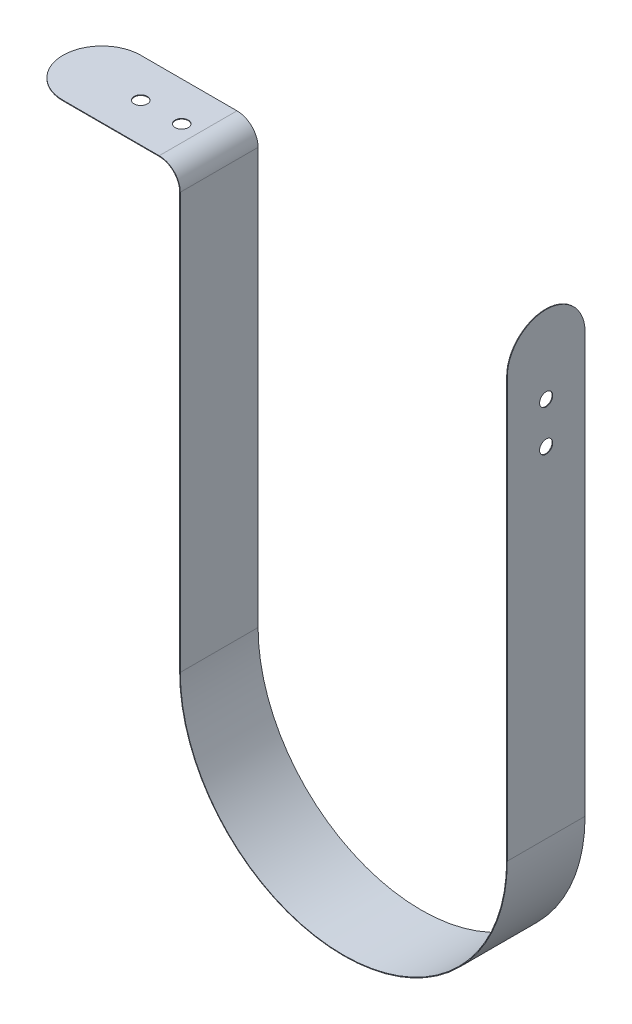
ISO-10303-21;
HEADER;
FILE_DESCRIPTION(('STEP AP214'),'2;1');
FILE_NAME('part.step','',(''),(''),'','','');
FILE_SCHEMA(('AUTOMOTIVE_DESIGN { 1 0 10303 214 1 1 1 1 }'));
ENDSEC;
DATA;
#1=APPLICATION_CONTEXT('core data for automotive mechanical design processes');
#2=APPLICATION_PROTOCOL_DEFINITION('international standard','automotive_design',2000,#1);
#3=PRODUCT_CONTEXT('',#1,'mechanical');
#4=PRODUCT('Part','Part','',(#3));
#5=PRODUCT_RELATED_PRODUCT_CATEGORY('part','',(#4));
#6=PRODUCT_DEFINITION_FORMATION('','',#4);
#7=PRODUCT_DEFINITION_CONTEXT('part definition',#1,'design');
#8=PRODUCT_DEFINITION('design','',#6,#7);
#9=PRODUCT_DEFINITION_SHAPE('','',#8);
#10=(LENGTH_UNIT() NAMED_UNIT(*) SI_UNIT(.MILLI.,.METRE.));
#11=(NAMED_UNIT(*) PLANE_ANGLE_UNIT() SI_UNIT($,.RADIAN.));
#12=(NAMED_UNIT(*) SI_UNIT($,.STERADIAN.) SOLID_ANGLE_UNIT());
#13=UNCERTAINTY_MEASURE_WITH_UNIT(LENGTH_MEASURE(1.E-05),#10,'distance_accuracy_value','');
#14=(GEOMETRIC_REPRESENTATION_CONTEXT(3) GLOBAL_UNCERTAINTY_ASSIGNED_CONTEXT((#13)) GLOBAL_UNIT_ASSIGNED_CONTEXT((#10,
#11,#12)) REPRESENTATION_CONTEXT('',''));
#15=CARTESIAN_POINT('',(0.,0.,0.));
#16=DIRECTION('',(0.,0.,1.));
#17=DIRECTION('',(1.,0.,0.));
#18=AXIS2_PLACEMENT_3D('',#15,#16,#17);
#19=CARTESIAN_POINT('',(0.,0.150000000000001,-9.5));
#20=DIRECTION('',(0.,1.,0.));
#21=DIRECTION('',(0.,0.,1.));
#22=AXIS2_PLACEMENT_3D('',#19,#20,#21);
#23=PLANE('',#22);
#24=CARTESIAN_POINT('',(4.,0.149999999999999,0.));
#25=DIRECTION('',(0.,1.,0.));
#26=DIRECTION('',(0.,0.,1.));
#27=AXIS2_PLACEMENT_3D('',#24,#25,#26);
#28=CIRCLE('',#27,1.6);
#29=CARTESIAN_POINT('',(4.,0.149999999999999,1.6));
#30=VERTEX_POINT('',#29);
#31=EDGE_CURVE('E303',#30,#30,#28,.T.);
#32=ORIENTED_EDGE('',*,*,#31,.F.);
#33=EDGE_LOOP('',(#32));
#34=FACE_BOUND('',#33,.T.);
#35=CARTESIAN_POINT('',(14.,0.149999999999999,0.));
#36=DIRECTION('',(0.,1.,0.));
#37=DIRECTION('',(0.,0.,1.));
#38=AXIS2_PLACEMENT_3D('',#35,#36,#37);
#39=CIRCLE('',#38,1.6);
#40=CARTESIAN_POINT('',(14.,0.149999999999999,1.6));
#41=VERTEX_POINT('',#40);
#42=EDGE_CURVE('E302',#41,#41,#39,.T.);
#43=ORIENTED_EDGE('',*,*,#42,.F.);
#44=EDGE_LOOP('',(#43));
#45=FACE_BOUND('',#44,.T.);
#46=CARTESIAN_POINT('',(-5.5,0.15,0.));
#47=DIRECTION('',(0.,1.,0.));
#48=DIRECTION('',(0.,0.,1.));
#49=AXIS2_PLACEMENT_3D('',#46,#47,#48);
#50=CIRCLE('',#49,9.5);
#51=CARTESIAN_POINT('',(-5.5,0.150000000000001,-9.5));
#52=VERTEX_POINT('',#51);
#53=CARTESIAN_POINT('',(-15.,0.15,0.));
#54=VERTEX_POINT('',#53);
#55=EDGE_CURVE('E313',#52,#54,#50,.T.);
#56=ORIENTED_EDGE('',*,*,#55,.T.);
#57=CARTESIAN_POINT('',(-5.5,0.15,0.));
#58=DIRECTION('',(0.,1.,0.));
#59=DIRECTION('',(0.,0.,1.));
#60=AXIS2_PLACEMENT_3D('',#57,#58,#59);
#61=CIRCLE('',#60,9.5);
#62=CARTESIAN_POINT('',(-5.5,0.149999999999998,9.5));
#63=VERTEX_POINT('',#62);
#64=EDGE_CURVE('E316',#54,#63,#61,.T.);
#65=ORIENTED_EDGE('',*,*,#64,.T.);
#66=DIRECTION('',(1.,0.,0.));
#67=VECTOR('',#66,1.);
#68=CARTESIAN_POINT('',(0.,0.149999999999998,9.5));
#69=LINE('',#68,#67);
#70=CARTESIAN_POINT('',(18.,0.149999999999998,9.5));
#71=VERTEX_POINT('',#70);
#72=EDGE_CURVE('E174',#63,#71,#69,.T.);
#73=ORIENTED_EDGE('',*,*,#72,.T.);
#74=DIRECTION('',(0.,0.,1.));
#75=VECTOR('',#74,1.);
#76=CARTESIAN_POINT('',(18.,0.150000000000001,-9.5));
#77=LINE('',#76,#75);
#78=CARTESIAN_POINT('',(18.,0.150000000000001,-9.5));
#79=VERTEX_POINT('',#78);
#80=EDGE_CURVE('E150',#79,#71,#77,.T.);
#81=ORIENTED_EDGE('',*,*,#80,.F.);
#82=DIRECTION('',(1.,0.,0.));
#83=VECTOR('',#82,1.);
#84=CARTESIAN_POINT('',(0.,0.150000000000001,-9.5));
#85=LINE('',#84,#83);
#86=EDGE_CURVE('E137',#52,#79,#85,.T.);
#87=ORIENTED_EDGE('',*,*,#86,.F.);
#88=EDGE_LOOP('',(#56,#65,#73,#81,#87));
#89=FACE_BOUND('',#88,.T.);
#90=ADVANCED_FACE('F37',(#34,#45,#89),#23,.T.);
#91=CARTESIAN_POINT('',(0.,0.149999999999998,9.5));
#92=DIRECTION('',(0.,0.,1.));
#93=DIRECTION('',(1.,0.,0.));
#94=AXIS2_PLACEMENT_3D('',#91,#92,#93);
#95=PLANE('',#94);
#96=ORIENTED_EDGE('',*,*,#72,.F.);
#97=DIRECTION('',(0.,-1.,0.));
#98=VECTOR('',#97,1.);
#99=CARTESIAN_POINT('',(-5.5,0.,9.5));
#100=LINE('',#99,#98);
#101=CARTESIAN_POINT('',(-5.5,0.,9.5));
#102=VERTEX_POINT('',#101);
#103=EDGE_CURVE('E287',#63,#102,#100,.T.);
#104=ORIENTED_EDGE('',*,*,#103,.T.);
#105=DIRECTION('',(1.,0.,0.));
#106=VECTOR('',#105,1.);
#107=CARTESIAN_POINT('',(0.,0.,9.5));
#108=LINE('',#107,#106);
#109=CARTESIAN_POINT('',(18.,0.,9.5));
#110=VERTEX_POINT('',#109);
#111=EDGE_CURVE('E231',#102,#110,#108,.T.);
#112=ORIENTED_EDGE('',*,*,#111,.T.);
#113=DIRECTION('',(0.,-1.,0.));
#114=VECTOR('',#113,1.);
#115=CARTESIAN_POINT('',(18.,0.149999999999998,9.5));
#116=LINE('',#115,#114);
#117=EDGE_CURVE('E181',#71,#110,#116,.T.);
#118=ORIENTED_EDGE('',*,*,#117,.F.);
#119=EDGE_LOOP('',(#96,#104,#112,#118));
#120=FACE_BOUND('',#119,.T.);
#121=ADVANCED_FACE('F402',(#120),#95,.T.);
#122=CARTESIAN_POINT('',(0.,0.,-9.5));
#123=DIRECTION('',(0.,-1.,0.));
#124=DIRECTION('',(0.,0.,-1.));
#125=AXIS2_PLACEMENT_3D('',#122,#123,#124);
#126=PLANE('',#125);
#127=CARTESIAN_POINT('',(4.,0.,0.));
#128=DIRECTION('',(0.,-1.,0.));
#129=DIRECTION('',(0.,0.,-1.));
#130=AXIS2_PLACEMENT_3D('',#127,#128,#129);
#131=CIRCLE('',#130,1.59999999999998);
#132=CARTESIAN_POINT('',(4.,0.,-1.59999999999998));
#133=VERTEX_POINT('',#132);
#134=EDGE_CURVE('E298',#133,#133,#131,.T.);
#135=ORIENTED_EDGE('',*,*,#134,.F.);
#136=EDGE_LOOP('',(#135));
#137=FACE_BOUND('',#136,.T.);
#138=CARTESIAN_POINT('',(14.,0.,0.));
#139=DIRECTION('',(0.,-1.,0.));
#140=DIRECTION('',(0.,0.,-1.));
#141=AXIS2_PLACEMENT_3D('',#138,#139,#140);
#142=CIRCLE('',#141,1.59999999999998);
#143=CARTESIAN_POINT('',(14.,0.,-1.59999999999998));
#144=VERTEX_POINT('',#143);
#145=EDGE_CURVE('E151',#144,#144,#142,.T.);
#146=ORIENTED_EDGE('',*,*,#145,.F.);
#147=EDGE_LOOP('',(#146));
#148=FACE_BOUND('',#147,.T.);
#149=ORIENTED_EDGE('',*,*,#111,.F.);
#150=CARTESIAN_POINT('',(-5.5,0.,0.));
#151=DIRECTION('',(0.,-1.,0.));
#152=DIRECTION('',(0.,0.,-1.));
#153=AXIS2_PLACEMENT_3D('',#150,#151,#152);
#154=CIRCLE('',#153,9.5);
#155=CARTESIAN_POINT('',(-15.,0.,0.));
#156=VERTEX_POINT('',#155);
#157=EDGE_CURVE('E310',#102,#156,#154,.T.);
#158=ORIENTED_EDGE('',*,*,#157,.T.);
#159=CARTESIAN_POINT('',(-5.5,0.,0.));
#160=DIRECTION('',(0.,-1.,0.));
#161=DIRECTION('',(0.,0.,-1.));
#162=AXIS2_PLACEMENT_3D('',#159,#160,#161);
#163=CIRCLE('',#162,9.5);
#164=CARTESIAN_POINT('',(-5.5,0.,-9.5));
#165=VERTEX_POINT('',#164);
#166=EDGE_CURVE('E307',#156,#165,#163,.T.);
#167=ORIENTED_EDGE('',*,*,#166,.T.);
#168=DIRECTION('',(1.,0.,0.));
#169=VECTOR('',#168,1.);
#170=CARTESIAN_POINT('',(0.,0.,-9.5));
#171=LINE('',#170,#169);
#172=CARTESIAN_POINT('',(18.,0.,-9.5));
#173=VERTEX_POINT('',#172);
#174=EDGE_CURVE('E171',#165,#173,#171,.T.);
#175=ORIENTED_EDGE('',*,*,#174,.T.);
#176=DIRECTION('',(0.,0.,-1.));
#177=VECTOR('',#176,1.);
#178=CARTESIAN_POINT('',(18.,0.,-9.5));
#179=LINE('',#178,#177);
#180=EDGE_CURVE('E234',#110,#173,#179,.T.);
#181=ORIENTED_EDGE('',*,*,#180,.F.);
#182=EDGE_LOOP('',(#149,#158,#167,#175,#181));
#183=FACE_BOUND('',#182,.T.);
#184=ADVANCED_FACE('F396',(#137,#148,#183),#126,.T.);
#185=CARTESIAN_POINT('',(0.,0.150000000000001,-9.5));
#186=DIRECTION('',(0.,0.,-1.));
#187=DIRECTION('',(-1.,0.,0.));
#188=AXIS2_PLACEMENT_3D('',#185,#186,#187);
#189=PLANE('',#188);
#190=ORIENTED_EDGE('',*,*,#174,.F.);
#191=DIRECTION('',(0.,1.,0.));
#192=VECTOR('',#191,1.);
#193=CARTESIAN_POINT('',(-5.5,0.150000000000001,-9.5));
#194=LINE('',#193,#192);
#195=EDGE_CURVE('E145',#165,#52,#194,.T.);
#196=ORIENTED_EDGE('',*,*,#195,.T.);
#197=ORIENTED_EDGE('',*,*,#86,.T.);
#198=DIRECTION('',(0.,1.,0.));
#199=VECTOR('',#198,1.);
#200=CARTESIAN_POINT('',(18.,0.150000000000001,-9.5));
#201=LINE('',#200,#199);
#202=EDGE_CURVE('E142',#173,#79,#201,.T.);
#203=ORIENTED_EDGE('',*,*,#202,.F.);
#204=EDGE_LOOP('',(#190,#196,#197,#203));
#205=FACE_BOUND('',#204,.T.);
#206=ADVANCED_FACE('F140',(#205),#189,.T.);
#207=CARTESIAN_POINT('',(18.,-5.,0.));
#208=DIRECTION('',(0.,0.,-1.));
#209=DIRECTION('',(-1.,0.,0.));
#210=AXIS2_PLACEMENT_3D('',#207,#208,#209);
#211=CYLINDRICAL_SURFACE('',#210,5.15);
#212=CARTESIAN_POINT('',(18.,-5.,9.5));
#213=DIRECTION('',(0.,0.,-1.));
#214=DIRECTION('',(0.,1.,0.));
#215=AXIS2_PLACEMENT_3D('',#212,#213,#214);
#216=CIRCLE('',#215,5.15);
#217=CARTESIAN_POINT('',(23.15,-5.,9.5));
#218=VERTEX_POINT('',#217);
#219=EDGE_CURVE('E188',#71,#218,#216,.T.);
#220=ORIENTED_EDGE('',*,*,#219,.T.);
#221=DIRECTION('',(0.,0.,1.));
#222=VECTOR('',#221,1.);
#223=CARTESIAN_POINT('',(23.15,-5.,-9.5));
#224=LINE('',#223,#222);
#225=CARTESIAN_POINT('',(23.15,-5.,-9.5));
#226=VERTEX_POINT('',#225);
#227=EDGE_CURVE('E161',#226,#218,#224,.T.);
#228=ORIENTED_EDGE('',*,*,#227,.F.);
#229=CARTESIAN_POINT('',(18.,-5.,-9.5));
#230=DIRECTION('',(0.,0.,-1.));
#231=DIRECTION('',(0.,1.,0.));
#232=AXIS2_PLACEMENT_3D('',#229,#230,#231);
#233=CIRCLE('',#232,5.15);
#234=EDGE_CURVE('E157',#79,#226,#233,.T.);
#235=ORIENTED_EDGE('',*,*,#234,.F.);
#236=ORIENTED_EDGE('',*,*,#80,.T.);
#237=EDGE_LOOP('',(#220,#228,#235,#236));
#238=FACE_BOUND('',#237,.T.);
#239=ADVANCED_FACE('F159',(#238),#211,.T.);
#240=CARTESIAN_POINT('',(18.,0.149999999999999,9.5));
#241=DIRECTION('',(0.,0.,1.));
#242=DIRECTION('',(1.,0.,0.));
#243=AXIS2_PLACEMENT_3D('',#240,#241,#242);
#244=PLANE('',#243);
#245=CARTESIAN_POINT('',(18.,-5.,9.5));
#246=DIRECTION('',(0.,0.,-1.));
#247=DIRECTION('',(0.,1.,0.));
#248=AXIS2_PLACEMENT_3D('',#245,#246,#247);
#249=CIRCLE('',#248,5.);
#250=CARTESIAN_POINT('',(23.,-5.,9.5));
#251=VERTEX_POINT('',#250);
#252=EDGE_CURVE('E238',#110,#251,#249,.T.);
#253=ORIENTED_EDGE('',*,*,#252,.T.);
#254=DIRECTION('',(-1.,0.,0.));
#255=VECTOR('',#254,1.);
#256=CARTESIAN_POINT('',(23.15,-5.,9.5));
#257=LINE('',#256,#255);
#258=EDGE_CURVE('E190',#218,#251,#257,.T.);
#259=ORIENTED_EDGE('',*,*,#258,.F.);
#260=ORIENTED_EDGE('',*,*,#219,.F.);
#261=ORIENTED_EDGE('',*,*,#117,.T.);
#262=EDGE_LOOP('',(#253,#259,#260,#261));
#263=FACE_BOUND('',#262,.T.);
#264=ADVANCED_FACE('F392',(#263),#244,.T.);
#265=CARTESIAN_POINT('',(18.,-5.,0.));
#266=DIRECTION('',(0.,0.,-1.));
#267=DIRECTION('',(-1.,0.,0.));
#268=AXIS2_PLACEMENT_3D('',#265,#266,#267);
#269=CYLINDRICAL_SURFACE('',#268,5.);
#270=CARTESIAN_POINT('',(18.,-5.,-9.5));
#271=DIRECTION('',(0.,0.,-1.));
#272=DIRECTION('',(0.,1.,0.));
#273=AXIS2_PLACEMENT_3D('',#270,#271,#272);
#274=CIRCLE('',#273,5.);
#275=CARTESIAN_POINT('',(23.,-5.,-9.5));
#276=VERTEX_POINT('',#275);
#277=EDGE_CURVE('E169',#173,#276,#274,.T.);
#278=ORIENTED_EDGE('',*,*,#277,.T.);
#279=DIRECTION('',(0.,0.,-1.));
#280=VECTOR('',#279,1.);
#281=CARTESIAN_POINT('',(23.,-5.,-9.5));
#282=LINE('',#281,#280);
#283=EDGE_CURVE('E242',#251,#276,#282,.T.);
#284=ORIENTED_EDGE('',*,*,#283,.F.);
#285=ORIENTED_EDGE('',*,*,#252,.F.);
#286=ORIENTED_EDGE('',*,*,#180,.T.);
#287=EDGE_LOOP('',(#278,#284,#285,#286));
#288=FACE_BOUND('',#287,.T.);
#289=ADVANCED_FACE('F383',(#288),#269,.F.);
#290=CARTESIAN_POINT('',(18.,0.150000000000002,-9.5));
#291=DIRECTION('',(0.,0.,-1.));
#292=DIRECTION('',(-1.,0.,0.));
#293=AXIS2_PLACEMENT_3D('',#290,#291,#292);
#294=PLANE('',#293);
#295=DIRECTION('',(1.,0.,0.));
#296=VECTOR('',#295,1.);
#297=CARTESIAN_POINT('',(23.15,-5.,-9.5));
#298=LINE('',#297,#296);
#299=EDGE_CURVE('E205',#276,#226,#298,.T.);
#300=ORIENTED_EDGE('',*,*,#299,.F.);
#301=ORIENTED_EDGE('',*,*,#277,.F.);
#302=ORIENTED_EDGE('',*,*,#202,.T.);
#303=ORIENTED_EDGE('',*,*,#234,.T.);
#304=EDGE_LOOP('',(#300,#301,#302,#303));
#305=FACE_BOUND('',#304,.T.);
#306=ADVANCED_FACE('F167',(#305),#294,.T.);
#307=CARTESIAN_POINT('',(23.15,-5.,-9.5));
#308=DIRECTION('',(1.,0.,0.));
#309=DIRECTION('',(0.,0.,-1.));
#310=AXIS2_PLACEMENT_3D('',#307,#308,#309);
#311=PLANE('',#310);
#312=DIRECTION('',(0.,-1.,0.));
#313=VECTOR('',#312,1.);
#314=CARTESIAN_POINT('',(23.15,-5.,9.5));
#315=LINE('',#314,#313);
#316=CARTESIAN_POINT('',(23.15,-106.544934807681,9.5));
#317=VERTEX_POINT('',#316);
#318=EDGE_CURVE('E196',#218,#317,#315,.T.);
#319=ORIENTED_EDGE('',*,*,#318,.T.);
#320=DIRECTION('',(0.,0.,1.));
#321=VECTOR('',#320,1.);
#322=CARTESIAN_POINT('',(23.15,-106.544934807681,-9.5));
#323=LINE('',#322,#321);
#324=CARTESIAN_POINT('',(23.15,-106.544934807681,-9.5));
#325=VERTEX_POINT('',#324);
#326=EDGE_CURVE('E192',#325,#317,#323,.T.);
#327=ORIENTED_EDGE('',*,*,#326,.F.);
#328=DIRECTION('',(0.,-1.,0.));
#329=VECTOR('',#328,1.);
#330=CARTESIAN_POINT('',(23.15,-5.,-9.5));
#331=LINE('',#330,#329);
#332=EDGE_CURVE('E197',#226,#325,#331,.T.);
#333=ORIENTED_EDGE('',*,*,#332,.F.);
#334=ORIENTED_EDGE('',*,*,#227,.T.);
#335=EDGE_LOOP('',(#319,#327,#333,#334));
#336=FACE_BOUND('',#335,.T.);
#337=ADVANCED_FACE('F379',(#336),#311,.T.);
#338=CARTESIAN_POINT('',(23.15,-5.,9.5));
#339=DIRECTION('',(0.,0.,1.));
#340=DIRECTION('',(1.,0.,0.));
#341=AXIS2_PLACEMENT_3D('',#338,#339,#340);
#342=PLANE('',#341);
#343=DIRECTION('',(0.,-1.,0.));
#344=VECTOR('',#343,1.);
#345=CARTESIAN_POINT('',(23.,-5.,9.5));
#346=LINE('',#345,#344);
#347=CARTESIAN_POINT('',(23.,-106.544934807681,9.5));
#348=VERTEX_POINT('',#347);
#349=EDGE_CURVE('E246',#251,#348,#346,.T.);
#350=ORIENTED_EDGE('',*,*,#349,.T.);
#351=DIRECTION('',(-1.,0.,0.));
#352=VECTOR('',#351,1.);
#353=CARTESIAN_POINT('',(23.15,-106.544934807681,9.5));
#354=LINE('',#353,#352);
#355=EDGE_CURVE('E201',#317,#348,#354,.T.);
#356=ORIENTED_EDGE('',*,*,#355,.F.);
#357=ORIENTED_EDGE('',*,*,#318,.F.);
#358=ORIENTED_EDGE('',*,*,#258,.T.);
#359=EDGE_LOOP('',(#350,#356,#357,#358));
#360=FACE_BOUND('',#359,.T.);
#361=ADVANCED_FACE('F389',(#360),#342,.T.);
#362=CARTESIAN_POINT('',(23.,-5.,-9.5));
#363=DIRECTION('',(-1.,0.,0.));
#364=DIRECTION('',(0.,0.,1.));
#365=AXIS2_PLACEMENT_3D('',#362,#363,#364);
#366=PLANE('',#365);
#367=DIRECTION('',(0.,-1.,0.));
#368=VECTOR('',#367,1.);
#369=CARTESIAN_POINT('',(23.,-5.,-9.5));
#370=LINE('',#369,#368);
#371=CARTESIAN_POINT('',(23.,-106.544934807681,-9.5));
#372=VERTEX_POINT('',#371);
#373=EDGE_CURVE('E274',#276,#372,#370,.T.);
#374=ORIENTED_EDGE('',*,*,#373,.T.);
#375=DIRECTION('',(0.,0.,-1.));
#376=VECTOR('',#375,1.);
#377=CARTESIAN_POINT('',(23.,-106.544934807681,-9.5));
#378=LINE('',#377,#376);
#379=EDGE_CURVE('E250',#348,#372,#378,.T.);
#380=ORIENTED_EDGE('',*,*,#379,.F.);
#381=ORIENTED_EDGE('',*,*,#349,.F.);
#382=ORIENTED_EDGE('',*,*,#283,.T.);
#383=EDGE_LOOP('',(#374,#380,#381,#382));
#384=FACE_BOUND('',#383,.T.);
#385=ADVANCED_FACE('F387',(#384),#366,.T.);
#386=CARTESIAN_POINT('',(23.15,-5.,-9.5));
#387=DIRECTION('',(0.,0.,-1.));
#388=DIRECTION('',(-1.,0.,0.));
#389=AXIS2_PLACEMENT_3D('',#386,#387,#388);
#390=PLANE('',#389);
#391=DIRECTION('',(1.,0.,0.));
#392=VECTOR('',#391,1.);
#393=CARTESIAN_POINT('',(23.15,-106.544934807681,-9.5));
#394=LINE('',#393,#392);
#395=EDGE_CURVE('E219',#372,#325,#394,.T.);
#396=ORIENTED_EDGE('',*,*,#395,.F.);
#397=ORIENTED_EDGE('',*,*,#373,.F.);
#398=ORIENTED_EDGE('',*,*,#299,.T.);
#399=ORIENTED_EDGE('',*,*,#332,.T.);
#400=EDGE_LOOP('',(#396,#397,#398,#399));
#401=FACE_BOUND('',#400,.T.);
#402=ADVANCED_FACE('F380',(#401),#390,.T.);
#403=CARTESIAN_POINT('',(63.,-106.544934807681,0.));
#404=DIRECTION('',(0.,0.,1.));
#405=DIRECTION('',(1.,0.,0.));
#406=AXIS2_PLACEMENT_3D('',#403,#404,#405);
#407=CYLINDRICAL_SURFACE('',#406,39.85);
#408=CARTESIAN_POINT('',(63.,-106.544934807681,9.5));
#409=DIRECTION('',(0.,0.,1.));
#410=DIRECTION('',(-1.,0.,0.));
#411=AXIS2_PLACEMENT_3D('',#408,#409,#410);
#412=CIRCLE('',#411,39.85);
#413=CARTESIAN_POINT('',(102.85,-106.544934807681,9.5));
#414=VERTEX_POINT('',#413);
#415=EDGE_CURVE('E210',#317,#414,#412,.T.);
#416=ORIENTED_EDGE('',*,*,#415,.T.);
#417=DIRECTION('',(0.,0.,1.));
#418=VECTOR('',#417,1.);
#419=CARTESIAN_POINT('',(102.85,-106.544934807681,-9.5));
#420=LINE('',#419,#418);
#421=CARTESIAN_POINT('',(102.85,-106.544934807681,-9.5));
#422=VERTEX_POINT('',#421);
#423=EDGE_CURVE('E206',#422,#414,#420,.T.);
#424=ORIENTED_EDGE('',*,*,#423,.F.);
#425=CARTESIAN_POINT('',(63.,-106.544934807681,-9.5));
#426=DIRECTION('',(0.,0.,1.));
#427=DIRECTION('',(-1.,0.,0.));
#428=AXIS2_PLACEMENT_3D('',#425,#426,#427);
#429=CIRCLE('',#428,39.85);
#430=EDGE_CURVE('E211',#325,#422,#429,.T.);
#431=ORIENTED_EDGE('',*,*,#430,.F.);
#432=ORIENTED_EDGE('',*,*,#326,.T.);
#433=EDGE_LOOP('',(#416,#424,#431,#432));
#434=FACE_BOUND('',#433,.T.);
#435=ADVANCED_FACE('F372',(#434),#407,.F.);
#436=CARTESIAN_POINT('',(23.15,-106.544934807681,9.5));
#437=DIRECTION('',(0.,0.,1.));
#438=DIRECTION('',(1.,0.,0.));
#439=AXIS2_PLACEMENT_3D('',#436,#437,#438);
#440=PLANE('',#439);
#441=CARTESIAN_POINT('',(63.,-106.544934807681,9.5));
#442=DIRECTION('',(0.,0.,1.));
#443=DIRECTION('',(-1.,0.,0.));
#444=AXIS2_PLACEMENT_3D('',#441,#442,#443);
#445=CIRCLE('',#444,40.);
#446=CARTESIAN_POINT('',(103.,-106.544934807681,9.5));
#447=VERTEX_POINT('',#446);
#448=EDGE_CURVE('E254',#348,#447,#445,.T.);
#449=ORIENTED_EDGE('',*,*,#448,.T.);
#450=DIRECTION('',(1.,0.,0.));
#451=VECTOR('',#450,1.);
#452=CARTESIAN_POINT('',(102.85,-106.544934807681,9.5));
#453=LINE('',#452,#451);
#454=EDGE_CURVE('E215',#414,#447,#453,.T.);
#455=ORIENTED_EDGE('',*,*,#454,.F.);
#456=ORIENTED_EDGE('',*,*,#415,.F.);
#457=ORIENTED_EDGE('',*,*,#355,.T.);
#458=EDGE_LOOP('',(#449,#455,#456,#457));
#459=FACE_BOUND('',#458,.T.);
#460=ADVANCED_FACE('F365',(#459),#440,.T.);
#461=CARTESIAN_POINT('',(63.,-106.544934807681,0.));
#462=DIRECTION('',(0.,0.,1.));
#463=DIRECTION('',(1.,0.,0.));
#464=AXIS2_PLACEMENT_3D('',#461,#462,#463);
#465=CYLINDRICAL_SURFACE('',#464,40.);
#466=CARTESIAN_POINT('',(63.,-106.544934807681,-9.5));
#467=DIRECTION('',(0.,0.,1.));
#468=DIRECTION('',(-1.,0.,0.));
#469=AXIS2_PLACEMENT_3D('',#466,#467,#468);
#470=CIRCLE('',#469,40.);
#471=CARTESIAN_POINT('',(103.,-106.544934807681,-9.5));
#472=VERTEX_POINT('',#471);
#473=EDGE_CURVE('E281',#372,#472,#470,.T.);
#474=ORIENTED_EDGE('',*,*,#473,.T.);
#475=DIRECTION('',(0.,0.,-1.));
#476=VECTOR('',#475,1.);
#477=CARTESIAN_POINT('',(103.,-106.544934807681,-9.5));
#478=LINE('',#477,#476);
#479=EDGE_CURVE('E258',#447,#472,#478,.T.);
#480=ORIENTED_EDGE('',*,*,#479,.F.);
#481=ORIENTED_EDGE('',*,*,#448,.F.);
#482=ORIENTED_EDGE('',*,*,#379,.T.);
#483=EDGE_LOOP('',(#474,#480,#481,#482));
#484=FACE_BOUND('',#483,.T.);
#485=ADVANCED_FACE('F361',(#484),#465,.T.);
#486=CARTESIAN_POINT('',(23.15,-106.544934807681,-9.5));
#487=DIRECTION('',(0.,0.,-1.));
#488=DIRECTION('',(-1.,0.,0.));
#489=AXIS2_PLACEMENT_3D('',#486,#487,#488);
#490=PLANE('',#489);
#491=DIRECTION('',(-1.,0.,0.));
#492=VECTOR('',#491,1.);
#493=CARTESIAN_POINT('',(102.85,-106.544934807681,-9.5));
#494=LINE('',#493,#492);
#495=EDGE_CURVE('E227',#472,#422,#494,.T.);
#496=ORIENTED_EDGE('',*,*,#495,.F.);
#497=ORIENTED_EDGE('',*,*,#473,.F.);
#498=ORIENTED_EDGE('',*,*,#395,.T.);
#499=ORIENTED_EDGE('',*,*,#430,.T.);
#500=EDGE_LOOP('',(#496,#497,#498,#499));
#501=FACE_BOUND('',#500,.T.);
#502=ADVANCED_FACE('F374',(#501),#490,.T.);
#503=CARTESIAN_POINT('',(102.85,-106.544934807681,-9.5));
#504=DIRECTION('',(-1.,0.,0.));
#505=DIRECTION('',(0.,0.,1.));
#506=AXIS2_PLACEMENT_3D('',#503,#504,#505);
#507=PLANE('',#506);
#508=CARTESIAN_POINT('',(102.85,-13.6075573929281,0.));
#509=DIRECTION('',(-1.,0.,0.));
#510=DIRECTION('',(0.,0.,1.));
#511=AXIS2_PLACEMENT_3D('',#508,#509,#510);
#512=CIRCLE('',#511,1.6);
#513=CARTESIAN_POINT('',(102.85,-13.6075573929281,1.59999999999999));
#514=VERTEX_POINT('',#513);
#515=EDGE_CURVE('E478',#514,#514,#512,.F.);
#516=ORIENTED_EDGE('',*,*,#515,.T.);
#517=EDGE_LOOP('',(#516));
#518=FACE_BOUND('',#517,.T.);
#519=CARTESIAN_POINT('',(102.85,-23.6075573929281,0.));
#520=DIRECTION('',(-1.,0.,0.));
#521=DIRECTION('',(0.,0.,1.));
#522=AXIS2_PLACEMENT_3D('',#519,#520,#521);
#523=CIRCLE('',#522,1.6);
#524=CARTESIAN_POINT('',(102.85,-23.6075573929281,1.59999999999999));
#525=VERTEX_POINT('',#524);
#526=EDGE_CURVE('E336',#525,#525,#523,.F.);
#527=ORIENTED_EDGE('',*,*,#526,.T.);
#528=EDGE_LOOP('',(#527));
#529=FACE_BOUND('',#528,.T.);
#530=DIRECTION('',(0.,1.,0.));
#531=VECTOR('',#530,1.);
#532=CARTESIAN_POINT('',(102.85,-106.544934807681,9.5));
#533=LINE('',#532,#531);
#534=CARTESIAN_POINT('',(102.85,-4.10755739292809,9.5));
#535=VERTEX_POINT('',#534);
#536=EDGE_CURVE('E220',#414,#535,#533,.T.);
#537=ORIENTED_EDGE('',*,*,#536,.T.);
#538=CARTESIAN_POINT('',(102.85,-4.10755739292807,0.));
#539=DIRECTION('',(-1.,0.,0.));
#540=DIRECTION('',(0.,0.,1.));
#541=AXIS2_PLACEMENT_3D('',#538,#539,#540);
#542=CIRCLE('',#541,9.5);
#543=CARTESIAN_POINT('',(102.85,5.39244260707193,0.));
#544=VERTEX_POINT('',#543);
#545=EDGE_CURVE('E47',#535,#544,#542,.T.);
#546=ORIENTED_EDGE('',*,*,#545,.T.);
#547=CARTESIAN_POINT('',(102.85,-4.10755739292807,0.));
#548=DIRECTION('',(-1.,0.,0.));
#549=DIRECTION('',(0.,0.,1.));
#550=AXIS2_PLACEMENT_3D('',#547,#548,#549);
#551=CIRCLE('',#550,9.5);
#552=CARTESIAN_POINT('',(102.85,-4.10755739292809,-9.5));
#553=VERTEX_POINT('',#552);
#554=EDGE_CURVE('E55',#544,#553,#551,.T.);
#555=ORIENTED_EDGE('',*,*,#554,.T.);
#556=DIRECTION('',(0.,1.,0.));
#557=VECTOR('',#556,1.);
#558=CARTESIAN_POINT('',(102.85,-106.544934807681,-9.5));
#559=LINE('',#558,#557);
#560=EDGE_CURVE('E224',#422,#553,#559,.T.);
#561=ORIENTED_EDGE('',*,*,#560,.F.);
#562=ORIENTED_EDGE('',*,*,#423,.T.);
#563=EDGE_LOOP('',(#537,#546,#555,#561,#562));
#564=FACE_BOUND('',#563,.T.);
#565=ADVANCED_FACE('F369',(#518,#529,#564),#507,.T.);
#566=CARTESIAN_POINT('',(102.85,-106.544934807681,9.5));
#567=DIRECTION('',(0.,0.,1.));
#568=DIRECTION('',(1.,0.,0.));
#569=AXIS2_PLACEMENT_3D('',#566,#567,#568);
#570=PLANE('',#569);
#571=DIRECTION('',(0.,1.,0.));
#572=VECTOR('',#571,1.);
#573=CARTESIAN_POINT('',(103.,-106.544934807681,9.5));
#574=LINE('',#573,#572);
#575=CARTESIAN_POINT('',(103.,-4.10755739292809,9.5));
#576=VERTEX_POINT('',#575);
#577=EDGE_CURVE('E223',#447,#576,#574,.T.);
#578=ORIENTED_EDGE('',*,*,#577,.T.);
#579=DIRECTION('',(1.,0.,0.));
#580=VECTOR('',#579,1.);
#581=CARTESIAN_POINT('',(102.85,-4.10755739292806,9.5));
#582=LINE('',#581,#580);
#583=EDGE_CURVE('E326',#576,#535,#582,.F.);
#584=ORIENTED_EDGE('',*,*,#583,.T.);
#585=ORIENTED_EDGE('',*,*,#536,.F.);
#586=ORIENTED_EDGE('',*,*,#454,.T.);
#587=EDGE_LOOP('',(#578,#584,#585,#586));
#588=FACE_BOUND('',#587,.T.);
#589=ADVANCED_FACE('F368',(#588),#570,.T.);
#590=CARTESIAN_POINT('',(103.,-106.544934807681,-9.5));
#591=DIRECTION('',(1.,0.,0.));
#592=DIRECTION('',(0.,0.,-1.));
#593=AXIS2_PLACEMENT_3D('',#590,#591,#592);
#594=PLANE('',#593);
#595=CARTESIAN_POINT('',(103.,-13.6075573929281,0.));
#596=DIRECTION('',(1.,0.,0.));
#597=DIRECTION('',(0.,1.,0.));
#598=AXIS2_PLACEMENT_3D('',#595,#596,#597);
#599=CIRCLE('',#598,1.6);
#600=CARTESIAN_POINT('',(103.,-12.0075573929281,0.));
#601=VERTEX_POINT('',#600);
#602=EDGE_CURVE('E481',#601,#601,#599,.T.);
#603=ORIENTED_EDGE('',*,*,#602,.F.);
#604=EDGE_LOOP('',(#603));
#605=FACE_BOUND('',#604,.T.);
#606=CARTESIAN_POINT('',(103.,-23.6075573929281,0.));
#607=DIRECTION('',(1.,0.,0.));
#608=DIRECTION('',(0.,1.,0.));
#609=AXIS2_PLACEMENT_3D('',#606,#607,#608);
#610=CIRCLE('',#609,1.6);
#611=CARTESIAN_POINT('',(103.,-22.0075573929281,0.));
#612=VERTEX_POINT('',#611);
#613=EDGE_CURVE('E342',#612,#612,#610,.T.);
#614=ORIENTED_EDGE('',*,*,#613,.F.);
#615=EDGE_LOOP('',(#614));
#616=FACE_BOUND('',#615,.T.);
#617=CARTESIAN_POINT('',(103.,-4.10755739292807,0.));
#618=DIRECTION('',(1.,0.,0.));
#619=DIRECTION('',(0.,0.,-1.));
#620=AXIS2_PLACEMENT_3D('',#617,#618,#619);
#621=CIRCLE('',#620,9.5);
#622=CARTESIAN_POINT('',(103.,-4.10755739292809,-9.5));
#623=VERTEX_POINT('',#622);
#624=CARTESIAN_POINT('',(103.,5.39244260707193,0.));
#625=VERTEX_POINT('',#624);
#626=EDGE_CURVE('E320',#623,#625,#621,.T.);
#627=ORIENTED_EDGE('',*,*,#626,.T.);
#628=CARTESIAN_POINT('',(103.,-4.10755739292807,0.));
#629=DIRECTION('',(1.,0.,0.));
#630=DIRECTION('',(0.,0.,-1.));
#631=AXIS2_PLACEMENT_3D('',#628,#629,#630);
#632=CIRCLE('',#631,9.5);
#633=EDGE_CURVE('E323',#625,#576,#632,.T.);
#634=ORIENTED_EDGE('',*,*,#633,.T.);
#635=ORIENTED_EDGE('',*,*,#577,.F.);
#636=ORIENTED_EDGE('',*,*,#479,.T.);
#637=DIRECTION('',(0.,1.,0.));
#638=VECTOR('',#637,1.);
#639=CARTESIAN_POINT('',(103.,-106.544934807681,-9.5));
#640=LINE('',#639,#638);
#641=EDGE_CURVE('E261',#472,#623,#640,.T.);
#642=ORIENTED_EDGE('',*,*,#641,.T.);
#643=EDGE_LOOP('',(#627,#634,#635,#636,#642));
#644=FACE_BOUND('',#643,.T.);
#645=ADVANCED_FACE('F358',(#605,#616,#644),#594,.T.);
#646=CARTESIAN_POINT('',(102.85,-106.544934807681,-9.5));
#647=DIRECTION('',(0.,0.,-1.));
#648=DIRECTION('',(-1.,0.,0.));
#649=AXIS2_PLACEMENT_3D('',#646,#647,#648);
#650=PLANE('',#649);
#651=ORIENTED_EDGE('',*,*,#560,.T.);
#652=DIRECTION('',(-1.,0.,0.));
#653=VECTOR('',#652,1.);
#654=CARTESIAN_POINT('',(102.85,-4.10755739292806,-9.5));
#655=LINE('',#654,#653);
#656=EDGE_CURVE('E12',#553,#623,#655,.F.);
#657=ORIENTED_EDGE('',*,*,#656,.T.);
#658=ORIENTED_EDGE('',*,*,#641,.F.);
#659=ORIENTED_EDGE('',*,*,#495,.T.);
#660=EDGE_LOOP('',(#651,#657,#658,#659));
#661=FACE_BOUND('',#660,.T.);
#662=ADVANCED_FACE('F355',(#661),#650,.T.);
#663=CARTESIAN_POINT('',(14.,0.15,0.));
#664=DIRECTION('',(0.,1.,0.));
#665=DIRECTION('',(0.,0.,1.));
#666=AXIS2_PLACEMENT_3D('',#663,#664,#665);
#667=CYLINDRICAL_SURFACE('',#666,1.59999999999998);
#668=ORIENTED_EDGE('',*,*,#145,.T.);
#669=EDGE_LOOP('',(#668));
#670=FACE_BOUND('',#669,.T.);
#671=ORIENTED_EDGE('',*,*,#42,.T.);
#672=EDGE_LOOP('',(#671));
#673=FACE_BOUND('',#672,.T.);
#674=ADVANCED_FACE('F414',(#670,#673),#667,.F.);
#675=CARTESIAN_POINT('',(4.,0.15,0.));
#676=DIRECTION('',(0.,1.,0.));
#677=DIRECTION('',(0.,0.,1.));
#678=AXIS2_PLACEMENT_3D('',#675,#676,#677);
#679=CYLINDRICAL_SURFACE('',#678,1.59999999999998);
#680=ORIENTED_EDGE('',*,*,#134,.T.);
#681=EDGE_LOOP('',(#680));
#682=FACE_BOUND('',#681,.T.);
#683=ORIENTED_EDGE('',*,*,#31,.T.);
#684=EDGE_LOOP('',(#683));
#685=FACE_BOUND('',#684,.T.);
#686=ADVANCED_FACE('F419',(#682,#685),#679,.F.);
#687=CARTESIAN_POINT('',(-0.00100000000009814,-23.6075573929282,0.));
#688=DIRECTION('',(1.,0.,0.));
#689=DIRECTION('',(0.,1.,0.));
#690=AXIS2_PLACEMENT_3D('',#687,#688,#689);
#691=CYLINDRICAL_SURFACE('',#690,1.6);
#692=ORIENTED_EDGE('',*,*,#526,.F.);
#693=EDGE_LOOP('',(#692));
#694=FACE_BOUND('',#693,.T.);
#695=ORIENTED_EDGE('',*,*,#613,.T.);
#696=EDGE_LOOP('',(#695));
#697=FACE_BOUND('',#696,.T.);
#698=ADVANCED_FACE('F466',(#694,#697),#691,.F.);
#699=CARTESIAN_POINT('',(-0.00100000000009814,-13.6075573929282,0.));
#700=DIRECTION('',(1.,0.,0.));
#701=DIRECTION('',(0.,1.,0.));
#702=AXIS2_PLACEMENT_3D('',#699,#700,#701);
#703=CYLINDRICAL_SURFACE('',#702,1.6);
#704=ORIENTED_EDGE('',*,*,#515,.F.);
#705=EDGE_LOOP('',(#704));
#706=FACE_BOUND('',#705,.T.);
#707=ORIENTED_EDGE('',*,*,#602,.T.);
#708=EDGE_LOOP('',(#707));
#709=FACE_BOUND('',#708,.T.);
#710=ADVANCED_FACE('F410',(#706,#709),#703,.F.);
#711=CARTESIAN_POINT('',(-5.5,0.150000000000001,0.));
#712=DIRECTION('',(0.,-1.,0.));
#713=DIRECTION('',(0.,0.,-1.));
#714=AXIS2_PLACEMENT_3D('',#711,#712,#713);
#715=CYLINDRICAL_SURFACE('',#714,9.5);
#716=DIRECTION('',(0.,1.,0.));
#717=VECTOR('',#716,1.);
#718=CARTESIAN_POINT('',(-15.,0.,0.));
#719=LINE('',#718,#717);
#720=EDGE_CURVE('E333',#54,#156,#719,.F.);
#721=ORIENTED_EDGE('',*,*,#720,.F.);
#722=ORIENTED_EDGE('',*,*,#55,.F.);
#723=ORIENTED_EDGE('',*,*,#195,.F.);
#724=ORIENTED_EDGE('',*,*,#166,.F.);
#725=EDGE_LOOP('',(#721,#722,#723,#724));
#726=FACE_BOUND('',#725,.T.);
#727=ADVANCED_FACE('F399',(#726),#715,.T.);
#728=CARTESIAN_POINT('',(-5.5,0.149999999999998,0.));
#729=DIRECTION('',(0.,1.,0.));
#730=DIRECTION('',(0.,0.,1.));
#731=AXIS2_PLACEMENT_3D('',#728,#729,#730);
#732=CYLINDRICAL_SURFACE('',#731,9.5);
#733=ORIENTED_EDGE('',*,*,#64,.F.);
#734=ORIENTED_EDGE('',*,*,#720,.T.);
#735=ORIENTED_EDGE('',*,*,#157,.F.);
#736=ORIENTED_EDGE('',*,*,#103,.F.);
#737=EDGE_LOOP('',(#733,#734,#735,#736));
#738=FACE_BOUND('',#737,.T.);
#739=ADVANCED_FACE('F403',(#738),#732,.T.);
#740=CARTESIAN_POINT('',(103.,-4.10755739292807,0.));
#741=DIRECTION('',(-1.,0.,0.));
#742=DIRECTION('',(0.,0.,1.));
#743=AXIS2_PLACEMENT_3D('',#740,#741,#742);
#744=CYLINDRICAL_SURFACE('',#743,9.5);
#745=ORIENTED_EDGE('',*,*,#656,.F.);
#746=ORIENTED_EDGE('',*,*,#554,.F.);
#747=DIRECTION('',(-1.,0.,0.));
#748=VECTOR('',#747,1.);
#749=CARTESIAN_POINT('',(103.,5.39244260707193,0.));
#750=LINE('',#749,#748);
#751=EDGE_CURVE('E41',#625,#544,#750,.T.);
#752=ORIENTED_EDGE('',*,*,#751,.F.);
#753=ORIENTED_EDGE('',*,*,#626,.F.);
#754=EDGE_LOOP('',(#745,#746,#752,#753));
#755=FACE_BOUND('',#754,.T.);
#756=ADVANCED_FACE('F39',(#755),#744,.T.);
#757=CARTESIAN_POINT('',(103.,-4.10755739292807,0.));
#758=DIRECTION('',(1.,0.,0.));
#759=DIRECTION('',(0.,0.,-1.));
#760=AXIS2_PLACEMENT_3D('',#757,#758,#759);
#761=CYLINDRICAL_SURFACE('',#760,9.5);
#762=ORIENTED_EDGE('',*,*,#545,.F.);
#763=ORIENTED_EDGE('',*,*,#583,.F.);
#764=ORIENTED_EDGE('',*,*,#633,.F.);
#765=ORIENTED_EDGE('',*,*,#751,.T.);
#766=EDGE_LOOP('',(#762,#763,#764,#765));
#767=FACE_BOUND('',#766,.T.);
#768=ADVANCED_FACE('F349',(#767),#761,.T.);
#769=CLOSED_SHELL('',(#90,#121,#184,#206,#239,#264,#289,#306,#337,#361,#385,#402,#435,#460,#485,
#502,#565,#589,#645,#662,#674,#686,#698,#710,#727,#739,#756,#768));
#770=MANIFOLD_SOLID_BREP('B2',#769);
#771=ADVANCED_BREP_SHAPE_REPRESENTATION('',(#18,#770),#14);
#772=SHAPE_DEFINITION_REPRESENTATION(#9,#771);
ENDSEC;
END-ISO-10303-21;
